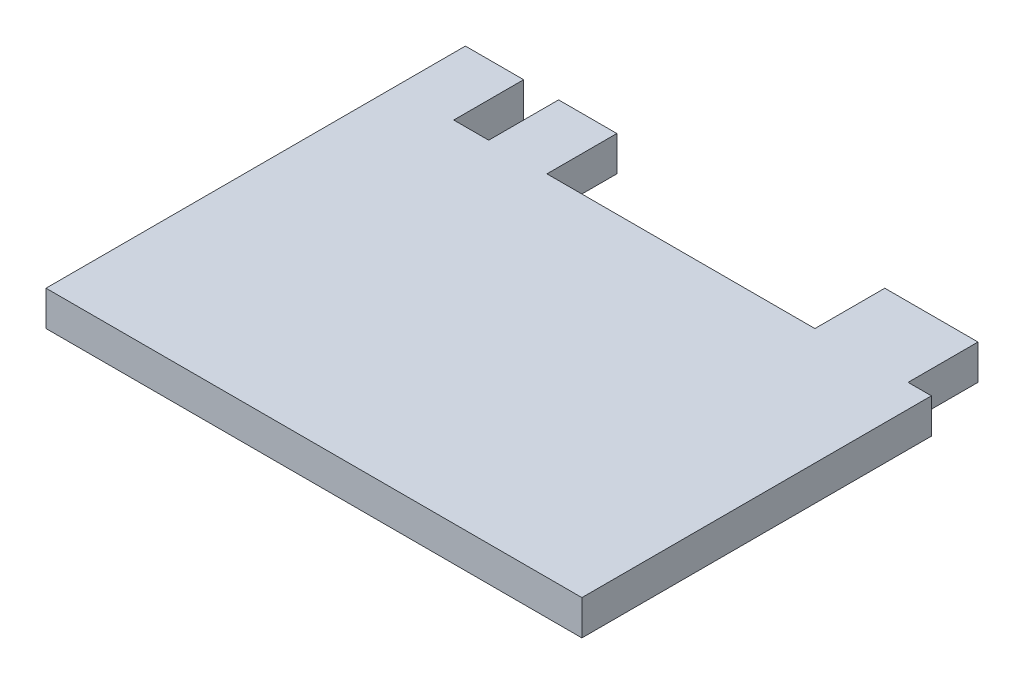
ISO-10303-21;
HEADER;
FILE_DESCRIPTION(('STEP AP214'),'2;1');
FILE_NAME('part.step','',(''),(''),'','','');
FILE_SCHEMA(('AUTOMOTIVE_DESIGN { 1 0 10303 214 1 1 1 1 }'));
ENDSEC;
DATA;
#1=APPLICATION_CONTEXT('core data for automotive mechanical design processes');
#2=APPLICATION_PROTOCOL_DEFINITION('international standard','automotive_design',2000,#1);
#3=PRODUCT_CONTEXT('',#1,'mechanical');
#4=PRODUCT('Part','Part','',(#3));
#5=PRODUCT_RELATED_PRODUCT_CATEGORY('part','',(#4));
#6=PRODUCT_DEFINITION_FORMATION('','',#4);
#7=PRODUCT_DEFINITION_CONTEXT('part definition',#1,'design');
#8=PRODUCT_DEFINITION('design','',#6,#7);
#9=PRODUCT_DEFINITION_SHAPE('','',#8);
#10=(LENGTH_UNIT() NAMED_UNIT(*) SI_UNIT(.MILLI.,.METRE.));
#11=(NAMED_UNIT(*) PLANE_ANGLE_UNIT() SI_UNIT($,.RADIAN.));
#12=(NAMED_UNIT(*) SI_UNIT($,.STERADIAN.) SOLID_ANGLE_UNIT());
#13=UNCERTAINTY_MEASURE_WITH_UNIT(LENGTH_MEASURE(1.E-05),#10,'distance_accuracy_value','');
#14=(GEOMETRIC_REPRESENTATION_CONTEXT(3) GLOBAL_UNCERTAINTY_ASSIGNED_CONTEXT((#13)) GLOBAL_UNIT_ASSIGNED_CONTEXT((#10,
#11,#12)) REPRESENTATION_CONTEXT('',''));
#15=CARTESIAN_POINT('',(0.,0.,0.));
#16=DIRECTION('',(0.,0.,1.));
#17=DIRECTION('',(1.,0.,0.));
#18=AXIS2_PLACEMENT_3D('',#15,#16,#17);
#19=CARTESIAN_POINT('',(11.5,1.5,0.));
#20=DIRECTION('',(-1.,0.,0.));
#21=DIRECTION('',(0.,0.,1.));
#22=AXIS2_PLACEMENT_3D('',#19,#20,#21);
#23=PLANE('',#22);
#24=DIRECTION('',(0.,0.,-1.));
#25=VECTOR('',#24,1.);
#26=CARTESIAN_POINT('',(11.5,0.,0.));
#27=LINE('',#26,#25);
#28=CARTESIAN_POINT('',(11.5,0.,0.));
#29=VERTEX_POINT('',#28);
#30=CARTESIAN_POINT('',(11.5,0.,-15.));
#31=VERTEX_POINT('',#30);
#32=EDGE_CURVE('E167',#29,#31,#27,.T.);
#33=ORIENTED_EDGE('',*,*,#32,.T.);
#34=DIRECTION('',(0.,-1.,0.));
#35=VECTOR('',#34,1.);
#36=CARTESIAN_POINT('',(11.5,1.5,-15.));
#37=LINE('',#36,#35);
#38=CARTESIAN_POINT('',(11.5,1.5,-15.));
#39=VERTEX_POINT('',#38);
#40=EDGE_CURVE('E41',#39,#31,#37,.T.);
#41=ORIENTED_EDGE('',*,*,#40,.F.);
#42=DIRECTION('',(0.,0.,-1.));
#43=VECTOR('',#42,1.);
#44=CARTESIAN_POINT('',(11.5,1.5,0.));
#45=LINE('',#44,#43);
#46=CARTESIAN_POINT('',(11.5,1.5,0.));
#47=VERTEX_POINT('',#46);
#48=EDGE_CURVE('E109',#47,#39,#45,.T.);
#49=ORIENTED_EDGE('',*,*,#48,.F.);
#50=DIRECTION('',(0.,-1.,0.));
#51=VECTOR('',#50,1.);
#52=CARTESIAN_POINT('',(11.5,1.5,0.));
#53=LINE('',#52,#51);
#54=EDGE_CURVE('E11',#47,#29,#53,.T.);
#55=ORIENTED_EDGE('',*,*,#54,.T.);
#56=EDGE_LOOP('',(#33,#41,#49,#55));
#57=FACE_BOUND('',#56,.T.);
#58=ADVANCED_FACE('F33',(#57),#23,.F.);
#59=CARTESIAN_POINT('',(11.5,1.5,-15.));
#60=DIRECTION('',(0.,0.,1.));
#61=DIRECTION('',(1.,0.,0.));
#62=AXIS2_PLACEMENT_3D('',#59,#60,#61);
#63=PLANE('',#62);
#64=DIRECTION('',(-1.,0.,0.));
#65=VECTOR('',#64,1.);
#66=CARTESIAN_POINT('',(11.5,0.,-15.));
#67=LINE('',#66,#65);
#68=CARTESIAN_POINT('',(10.5,0.,-15.));
#69=VERTEX_POINT('',#68);
#70=EDGE_CURVE('E169',#31,#69,#67,.T.);
#71=ORIENTED_EDGE('',*,*,#70,.T.);
#72=DIRECTION('',(0.,-1.,0.));
#73=VECTOR('',#72,1.);
#74=CARTESIAN_POINT('',(10.5,1.5,-15.));
#75=LINE('',#74,#73);
#76=CARTESIAN_POINT('',(10.5,1.5,-15.));
#77=VERTEX_POINT('',#76);
#78=EDGE_CURVE('E218',#77,#69,#75,.T.);
#79=ORIENTED_EDGE('',*,*,#78,.F.);
#80=DIRECTION('',(-1.,0.,0.));
#81=VECTOR('',#80,1.);
#82=CARTESIAN_POINT('',(11.5,1.5,-15.));
#83=LINE('',#82,#81);
#84=EDGE_CURVE('E226',#39,#77,#83,.T.);
#85=ORIENTED_EDGE('',*,*,#84,.F.);
#86=ORIENTED_EDGE('',*,*,#40,.T.);
#87=EDGE_LOOP('',(#71,#79,#85,#86));
#88=FACE_BOUND('',#87,.T.);
#89=ADVANCED_FACE('F224',(#88),#63,.F.);
#90=CARTESIAN_POINT('',(10.5,1.5,-15.));
#91=DIRECTION('',(-1.,0.,0.));
#92=DIRECTION('',(0.,0.,1.));
#93=AXIS2_PLACEMENT_3D('',#90,#91,#92);
#94=PLANE('',#93);
#95=DIRECTION('',(0.,0.,-1.));
#96=VECTOR('',#95,1.);
#97=CARTESIAN_POINT('',(10.5,0.,-15.));
#98=LINE('',#97,#96);
#99=CARTESIAN_POINT('',(10.5,0.,-18.));
#100=VERTEX_POINT('',#99);
#101=EDGE_CURVE('E171',#69,#100,#98,.T.);
#102=ORIENTED_EDGE('',*,*,#101,.T.);
#103=DIRECTION('',(0.,-1.,0.));
#104=VECTOR('',#103,1.);
#105=CARTESIAN_POINT('',(10.5,1.5,-18.));
#106=LINE('',#105,#104);
#107=CARTESIAN_POINT('',(10.5,1.5,-18.));
#108=VERTEX_POINT('',#107);
#109=EDGE_CURVE('E215',#108,#100,#106,.T.);
#110=ORIENTED_EDGE('',*,*,#109,.F.);
#111=DIRECTION('',(0.,0.,-1.));
#112=VECTOR('',#111,1.);
#113=CARTESIAN_POINT('',(10.5,1.5,-15.));
#114=LINE('',#113,#112);
#115=EDGE_CURVE('E243',#77,#108,#114,.T.);
#116=ORIENTED_EDGE('',*,*,#115,.F.);
#117=ORIENTED_EDGE('',*,*,#78,.T.);
#118=EDGE_LOOP('',(#102,#110,#116,#117));
#119=FACE_BOUND('',#118,.T.);
#120=ADVANCED_FACE('F234',(#119),#94,.F.);
#121=CARTESIAN_POINT('',(10.5,1.5,-18.));
#122=DIRECTION('',(0.,0.,1.));
#123=DIRECTION('',(1.,0.,0.));
#124=AXIS2_PLACEMENT_3D('',#121,#122,#123);
#125=PLANE('',#124);
#126=DIRECTION('',(-1.,0.,0.));
#127=VECTOR('',#126,1.);
#128=CARTESIAN_POINT('',(10.5,0.,-18.));
#129=LINE('',#128,#127);
#130=CARTESIAN_POINT('',(6.5,0.,-18.));
#131=VERTEX_POINT('',#130);
#132=EDGE_CURVE('E173',#100,#131,#129,.T.);
#133=ORIENTED_EDGE('',*,*,#132,.T.);
#134=DIRECTION('',(0.,-1.,0.));
#135=VECTOR('',#134,1.);
#136=CARTESIAN_POINT('',(6.5,1.5,-18.));
#137=LINE('',#136,#135);
#138=CARTESIAN_POINT('',(6.5,1.5,-18.));
#139=VERTEX_POINT('',#138);
#140=EDGE_CURVE('E212',#139,#131,#137,.T.);
#141=ORIENTED_EDGE('',*,*,#140,.F.);
#142=DIRECTION('',(-1.,0.,0.));
#143=VECTOR('',#142,1.);
#144=CARTESIAN_POINT('',(10.5,1.5,-18.));
#145=LINE('',#144,#143);
#146=EDGE_CURVE('E240',#108,#139,#145,.T.);
#147=ORIENTED_EDGE('',*,*,#146,.F.);
#148=ORIENTED_EDGE('',*,*,#109,.T.);
#149=EDGE_LOOP('',(#133,#141,#147,#148));
#150=FACE_BOUND('',#149,.T.);
#151=ADVANCED_FACE('F238',(#150),#125,.F.);
#152=CARTESIAN_POINT('',(6.5,1.5,-18.));
#153=DIRECTION('',(1.,0.,0.));
#154=DIRECTION('',(0.,0.,-1.));
#155=AXIS2_PLACEMENT_3D('',#152,#153,#154);
#156=PLANE('',#155);
#157=DIRECTION('',(0.,0.,1.));
#158=VECTOR('',#157,1.);
#159=CARTESIAN_POINT('',(6.5,0.,-18.));
#160=LINE('',#159,#158);
#161=CARTESIAN_POINT('',(6.5,0.,-15.));
#162=VERTEX_POINT('',#161);
#163=EDGE_CURVE('E175',#131,#162,#160,.T.);
#164=ORIENTED_EDGE('',*,*,#163,.T.);
#165=DIRECTION('',(0.,-1.,0.));
#166=VECTOR('',#165,1.);
#167=CARTESIAN_POINT('',(6.5,1.5,-15.));
#168=LINE('',#167,#166);
#169=CARTESIAN_POINT('',(6.5,1.5,-15.));
#170=VERTEX_POINT('',#169);
#171=EDGE_CURVE('E209',#170,#162,#168,.T.);
#172=ORIENTED_EDGE('',*,*,#171,.F.);
#173=DIRECTION('',(0.,0.,1.));
#174=VECTOR('',#173,1.);
#175=CARTESIAN_POINT('',(6.5,1.5,-18.));
#176=LINE('',#175,#174);
#177=EDGE_CURVE('E242',#139,#170,#176,.T.);
#178=ORIENTED_EDGE('',*,*,#177,.F.);
#179=ORIENTED_EDGE('',*,*,#140,.T.);
#180=EDGE_LOOP('',(#164,#172,#178,#179));
#181=FACE_BOUND('',#180,.T.);
#182=ADVANCED_FACE('F283',(#181),#156,.F.);
#183=CARTESIAN_POINT('',(6.5,1.5,-15.));
#184=DIRECTION('',(0.,0.,1.));
#185=DIRECTION('',(1.,0.,0.));
#186=AXIS2_PLACEMENT_3D('',#183,#184,#185);
#187=PLANE('',#186);
#188=DIRECTION('',(-1.,0.,0.));
#189=VECTOR('',#188,1.);
#190=CARTESIAN_POINT('',(6.5,0.,-15.));
#191=LINE('',#190,#189);
#192=CARTESIAN_POINT('',(-5.,0.,-15.));
#193=VERTEX_POINT('',#192);
#194=EDGE_CURVE('E177',#162,#193,#191,.T.);
#195=ORIENTED_EDGE('',*,*,#194,.T.);
#196=DIRECTION('',(0.,-1.,0.));
#197=VECTOR('',#196,1.);
#198=CARTESIAN_POINT('',(-5.,1.5,-15.));
#199=LINE('',#198,#197);
#200=CARTESIAN_POINT('',(-5.,1.5,-15.));
#201=VERTEX_POINT('',#200);
#202=EDGE_CURVE('E206',#201,#193,#199,.T.);
#203=ORIENTED_EDGE('',*,*,#202,.F.);
#204=DIRECTION('',(-1.,0.,0.));
#205=VECTOR('',#204,1.);
#206=CARTESIAN_POINT('',(6.5,1.5,-15.));
#207=LINE('',#206,#205);
#208=EDGE_CURVE('E245',#170,#201,#207,.T.);
#209=ORIENTED_EDGE('',*,*,#208,.F.);
#210=ORIENTED_EDGE('',*,*,#171,.T.);
#211=EDGE_LOOP('',(#195,#203,#209,#210));
#212=FACE_BOUND('',#211,.T.);
#213=ADVANCED_FACE('F286',(#212),#187,.F.);
#214=CARTESIAN_POINT('',(-5.,1.5,-18.));
#215=DIRECTION('',(-1.,0.,0.));
#216=DIRECTION('',(0.,0.,1.));
#217=AXIS2_PLACEMENT_3D('',#214,#215,#216);
#218=PLANE('',#217);
#219=DIRECTION('',(0.,0.,-1.));
#220=VECTOR('',#219,1.);
#221=CARTESIAN_POINT('',(-5.,0.,-18.));
#222=LINE('',#221,#220);
#223=CARTESIAN_POINT('',(-5.,0.,-18.));
#224=VERTEX_POINT('',#223);
#225=EDGE_CURVE('E179',#193,#224,#222,.T.);
#226=ORIENTED_EDGE('',*,*,#225,.T.);
#227=DIRECTION('',(0.,-1.,0.));
#228=VECTOR('',#227,1.);
#229=CARTESIAN_POINT('',(-5.,1.5,-18.));
#230=LINE('',#229,#228);
#231=CARTESIAN_POINT('',(-5.,1.5,-18.));
#232=VERTEX_POINT('',#231);
#233=EDGE_CURVE('E203',#232,#224,#230,.T.);
#234=ORIENTED_EDGE('',*,*,#233,.F.);
#235=DIRECTION('',(0.,0.,-1.));
#236=VECTOR('',#235,1.);
#237=CARTESIAN_POINT('',(-5.,1.5,-18.));
#238=LINE('',#237,#236);
#239=EDGE_CURVE('E251',#201,#232,#238,.T.);
#240=ORIENTED_EDGE('',*,*,#239,.F.);
#241=ORIENTED_EDGE('',*,*,#202,.T.);
#242=EDGE_LOOP('',(#226,#234,#240,#241));
#243=FACE_BOUND('',#242,.T.);
#244=ADVANCED_FACE('F290',(#243),#218,.F.);
#245=CARTESIAN_POINT('',(-7.5,1.5,-18.));
#246=DIRECTION('',(0.,0.,1.));
#247=DIRECTION('',(1.,0.,0.));
#248=AXIS2_PLACEMENT_3D('',#245,#246,#247);
#249=PLANE('',#248);
#250=DIRECTION('',(-1.,0.,0.));
#251=VECTOR('',#250,1.);
#252=CARTESIAN_POINT('',(-7.5,0.,-18.));
#253=LINE('',#252,#251);
#254=CARTESIAN_POINT('',(-7.5,0.,-18.));
#255=VERTEX_POINT('',#254);
#256=EDGE_CURVE('E181',#224,#255,#253,.T.);
#257=ORIENTED_EDGE('',*,*,#256,.T.);
#258=DIRECTION('',(0.,-1.,0.));
#259=VECTOR('',#258,1.);
#260=CARTESIAN_POINT('',(-7.5,1.5,-18.));
#261=LINE('',#260,#259);
#262=CARTESIAN_POINT('',(-7.5,1.5,-18.));
#263=VERTEX_POINT('',#262);
#264=EDGE_CURVE('E200',#263,#255,#261,.T.);
#265=ORIENTED_EDGE('',*,*,#264,.F.);
#266=DIRECTION('',(-1.,0.,0.));
#267=VECTOR('',#266,1.);
#268=CARTESIAN_POINT('',(-7.5,1.5,-18.));
#269=LINE('',#268,#267);
#270=EDGE_CURVE('E253',#232,#263,#269,.T.);
#271=ORIENTED_EDGE('',*,*,#270,.F.);
#272=ORIENTED_EDGE('',*,*,#233,.T.);
#273=EDGE_LOOP('',(#257,#265,#271,#272));
#274=FACE_BOUND('',#273,.T.);
#275=ADVANCED_FACE('F294',(#274),#249,.F.);
#276=CARTESIAN_POINT('',(-7.5,1.5,-18.));
#277=DIRECTION('',(1.,0.,0.));
#278=DIRECTION('',(0.,0.,-1.));
#279=AXIS2_PLACEMENT_3D('',#276,#277,#278);
#280=PLANE('',#279);
#281=DIRECTION('',(0.,0.,1.));
#282=VECTOR('',#281,1.);
#283=CARTESIAN_POINT('',(-7.5,0.,-18.));
#284=LINE('',#283,#282);
#285=CARTESIAN_POINT('',(-7.5,0.,-15.));
#286=VERTEX_POINT('',#285);
#287=EDGE_CURVE('E183',#255,#286,#284,.T.);
#288=ORIENTED_EDGE('',*,*,#287,.T.);
#289=DIRECTION('',(0.,-1.,0.));
#290=VECTOR('',#289,1.);
#291=CARTESIAN_POINT('',(-7.5,1.5,-15.));
#292=LINE('',#291,#290);
#293=CARTESIAN_POINT('',(-7.5,1.5,-15.));
#294=VERTEX_POINT('',#293);
#295=EDGE_CURVE('E197',#294,#286,#292,.T.);
#296=ORIENTED_EDGE('',*,*,#295,.F.);
#297=DIRECTION('',(0.,0.,1.));
#298=VECTOR('',#297,1.);
#299=CARTESIAN_POINT('',(-7.5,1.5,-18.));
#300=LINE('',#299,#298);
#301=EDGE_CURVE('E255',#263,#294,#300,.T.);
#302=ORIENTED_EDGE('',*,*,#301,.F.);
#303=ORIENTED_EDGE('',*,*,#264,.T.);
#304=EDGE_LOOP('',(#288,#296,#302,#303));
#305=FACE_BOUND('',#304,.T.);
#306=ADVANCED_FACE('F261',(#305),#280,.F.);
#307=CARTESIAN_POINT('',(-7.5,1.5,-15.));
#308=DIRECTION('',(0.,0.,1.));
#309=DIRECTION('',(1.,0.,0.));
#310=AXIS2_PLACEMENT_3D('',#307,#308,#309);
#311=PLANE('',#310);
#312=DIRECTION('',(-1.,0.,0.));
#313=VECTOR('',#312,1.);
#314=CARTESIAN_POINT('',(-7.5,0.,-15.));
#315=LINE('',#314,#313);
#316=CARTESIAN_POINT('',(-9.,0.,-15.));
#317=VERTEX_POINT('',#316);
#318=EDGE_CURVE('E185',#286,#317,#315,.T.);
#319=ORIENTED_EDGE('',*,*,#318,.T.);
#320=DIRECTION('',(0.,-1.,0.));
#321=VECTOR('',#320,1.);
#322=CARTESIAN_POINT('',(-9.,1.5,-15.));
#323=LINE('',#322,#321);
#324=CARTESIAN_POINT('',(-9.,1.5,-15.));
#325=VERTEX_POINT('',#324);
#326=EDGE_CURVE('E158',#325,#317,#323,.T.);
#327=ORIENTED_EDGE('',*,*,#326,.F.);
#328=DIRECTION('',(-1.,0.,0.));
#329=VECTOR('',#328,1.);
#330=CARTESIAN_POINT('',(-7.5,1.5,-15.));
#331=LINE('',#330,#329);
#332=EDGE_CURVE('E147',#294,#325,#331,.T.);
#333=ORIENTED_EDGE('',*,*,#332,.F.);
#334=ORIENTED_EDGE('',*,*,#295,.T.);
#335=EDGE_LOOP('',(#319,#327,#333,#334));
#336=FACE_BOUND('',#335,.T.);
#337=ADVANCED_FACE('F265',(#336),#311,.F.);
#338=CARTESIAN_POINT('',(-9.,1.5,-18.));
#339=DIRECTION('',(-1.,0.,0.));
#340=DIRECTION('',(0.,0.,1.));
#341=AXIS2_PLACEMENT_3D('',#338,#339,#340);
#342=PLANE('',#341);
#343=DIRECTION('',(0.,0.,-1.));
#344=VECTOR('',#343,1.);
#345=CARTESIAN_POINT('',(-9.,0.,-18.));
#346=LINE('',#345,#344);
#347=CARTESIAN_POINT('',(-9.,0.,-18.));
#348=VERTEX_POINT('',#347);
#349=EDGE_CURVE('E156',#317,#348,#346,.T.);
#350=ORIENTED_EDGE('',*,*,#349,.T.);
#351=DIRECTION('',(0.,-1.,0.));
#352=VECTOR('',#351,1.);
#353=CARTESIAN_POINT('',(-9.,1.5,-18.));
#354=LINE('',#353,#352);
#355=CARTESIAN_POINT('',(-9.,1.5,-18.));
#356=VERTEX_POINT('',#355);
#357=EDGE_CURVE('E153',#356,#348,#354,.T.);
#358=ORIENTED_EDGE('',*,*,#357,.F.);
#359=DIRECTION('',(0.,0.,-1.));
#360=VECTOR('',#359,1.);
#361=CARTESIAN_POINT('',(-9.,1.5,-18.));
#362=LINE('',#361,#360);
#363=EDGE_CURVE('E140',#325,#356,#362,.T.);
#364=ORIENTED_EDGE('',*,*,#363,.F.);
#365=ORIENTED_EDGE('',*,*,#326,.T.);
#366=EDGE_LOOP('',(#350,#358,#364,#365));
#367=FACE_BOUND('',#366,.T.);
#368=ADVANCED_FACE('F154',(#367),#342,.F.);
#369=CARTESIAN_POINT('',(-11.5,1.5,-18.));
#370=DIRECTION('',(0.,0.,1.));
#371=DIRECTION('',(1.,0.,0.));
#372=AXIS2_PLACEMENT_3D('',#369,#370,#371);
#373=PLANE('',#372);
#374=DIRECTION('',(-1.,0.,0.));
#375=VECTOR('',#374,1.);
#376=CARTESIAN_POINT('',(-11.5,0.,-18.));
#377=LINE('',#376,#375);
#378=CARTESIAN_POINT('',(-11.5,0.,-18.));
#379=VERTEX_POINT('',#378);
#380=EDGE_CURVE('E188',#348,#379,#377,.T.);
#381=ORIENTED_EDGE('',*,*,#380,.T.);
#382=DIRECTION('',(0.,-1.,0.));
#383=VECTOR('',#382,1.);
#384=CARTESIAN_POINT('',(-11.5,1.5,-18.));
#385=LINE('',#384,#383);
#386=CARTESIAN_POINT('',(-11.5,1.5,-18.));
#387=VERTEX_POINT('',#386);
#388=EDGE_CURVE('E159',#387,#379,#385,.T.);
#389=ORIENTED_EDGE('',*,*,#388,.F.);
#390=DIRECTION('',(-1.,0.,0.));
#391=VECTOR('',#390,1.);
#392=CARTESIAN_POINT('',(-11.5,1.5,-18.));
#393=LINE('',#392,#391);
#394=EDGE_CURVE('E144',#356,#387,#393,.T.);
#395=ORIENTED_EDGE('',*,*,#394,.F.);
#396=ORIENTED_EDGE('',*,*,#357,.T.);
#397=EDGE_LOOP('',(#381,#389,#395,#396));
#398=FACE_BOUND('',#397,.T.);
#399=ADVANCED_FACE('F161',(#398),#373,.F.);
#400=CARTESIAN_POINT('',(-11.5,1.5,-15.));
#401=DIRECTION('',(1.,0.,0.));
#402=DIRECTION('',(0.,0.,-1.));
#403=AXIS2_PLACEMENT_3D('',#400,#401,#402);
#404=PLANE('',#403);
#405=DIRECTION('',(0.,0.,1.));
#406=VECTOR('',#405,1.);
#407=CARTESIAN_POINT('',(-11.5,0.,-15.));
#408=LINE('',#407,#406);
#409=CARTESIAN_POINT('',(-11.5,0.,0.));
#410=VERTEX_POINT('',#409);
#411=EDGE_CURVE('E96',#379,#410,#408,.T.);
#412=ORIENTED_EDGE('',*,*,#411,.T.);
#413=DIRECTION('',(0.,-1.,0.));
#414=VECTOR('',#413,1.);
#415=CARTESIAN_POINT('',(-11.5,1.5,0.));
#416=LINE('',#415,#414);
#417=CARTESIAN_POINT('',(-11.5,1.5,0.));
#418=VERTEX_POINT('',#417);
#419=EDGE_CURVE('E163',#418,#410,#416,.T.);
#420=ORIENTED_EDGE('',*,*,#419,.F.);
#421=DIRECTION('',(0.,0.,1.));
#422=VECTOR('',#421,1.);
#423=CARTESIAN_POINT('',(-11.5,1.5,-15.));
#424=LINE('',#423,#422);
#425=EDGE_CURVE('E49',#387,#418,#424,.T.);
#426=ORIENTED_EDGE('',*,*,#425,.F.);
#427=ORIENTED_EDGE('',*,*,#388,.T.);
#428=EDGE_LOOP('',(#412,#420,#426,#427));
#429=FACE_BOUND('',#428,.T.);
#430=ADVANCED_FACE('F266',(#429),#404,.F.);
#431=CARTESIAN_POINT('',(0.,1.5,0.));
#432=DIRECTION('',(0.,0.,-1.));
#433=DIRECTION('',(-1.,0.,0.));
#434=AXIS2_PLACEMENT_3D('',#431,#432,#433);
#435=PLANE('',#434);
#436=DIRECTION('',(1.,0.,0.));
#437=VECTOR('',#436,1.);
#438=CARTESIAN_POINT('',(0.,0.,0.));
#439=LINE('',#438,#437);
#440=EDGE_CURVE('E191',#410,#29,#439,.T.);
#441=ORIENTED_EDGE('',*,*,#440,.T.);
#442=ORIENTED_EDGE('',*,*,#54,.F.);
#443=DIRECTION('',(1.,0.,0.));
#444=VECTOR('',#443,1.);
#445=CARTESIAN_POINT('',(0.,1.5,0.));
#446=LINE('',#445,#444);
#447=EDGE_CURVE('E193',#418,#47,#446,.T.);
#448=ORIENTED_EDGE('',*,*,#447,.F.);
#449=ORIENTED_EDGE('',*,*,#419,.T.);
#450=EDGE_LOOP('',(#441,#442,#448,#449));
#451=FACE_BOUND('',#450,.T.);
#452=ADVANCED_FACE('F268',(#451),#435,.F.);
#453=CARTESIAN_POINT('',(0.,1.5,0.));
#454=DIRECTION('',(0.,1.,0.));
#455=DIRECTION('',(0.,0.,1.));
#456=AXIS2_PLACEMENT_3D('',#453,#454,#455);
#457=PLANE('',#456);
#458=ORIENTED_EDGE('',*,*,#447,.T.);
#459=ORIENTED_EDGE('',*,*,#48,.T.);
#460=ORIENTED_EDGE('',*,*,#84,.T.);
#461=ORIENTED_EDGE('',*,*,#115,.T.);
#462=ORIENTED_EDGE('',*,*,#146,.T.);
#463=ORIENTED_EDGE('',*,*,#177,.T.);
#464=ORIENTED_EDGE('',*,*,#208,.T.);
#465=ORIENTED_EDGE('',*,*,#239,.T.);
#466=ORIENTED_EDGE('',*,*,#270,.T.);
#467=ORIENTED_EDGE('',*,*,#301,.T.);
#468=ORIENTED_EDGE('',*,*,#332,.T.);
#469=ORIENTED_EDGE('',*,*,#363,.T.);
#470=ORIENTED_EDGE('',*,*,#394,.T.);
#471=ORIENTED_EDGE('',*,*,#425,.T.);
#472=EDGE_LOOP('',(#458,#459,#460,#461,#462,#463,#464,#465,#466,#467,#468,#469,#470,#471));
#473=FACE_BOUND('',#472,.T.);
#474=ADVANCED_FACE('F142',(#473),#457,.T.);
#475=CARTESIAN_POINT('',(0.,0.,0.));
#476=DIRECTION('',(0.,1.,0.));
#477=DIRECTION('',(0.,0.,1.));
#478=AXIS2_PLACEMENT_3D('',#475,#476,#477);
#479=PLANE('',#478);
#480=ORIENTED_EDGE('',*,*,#32,.F.);
#481=ORIENTED_EDGE('',*,*,#440,.F.);
#482=ORIENTED_EDGE('',*,*,#411,.F.);
#483=ORIENTED_EDGE('',*,*,#380,.F.);
#484=ORIENTED_EDGE('',*,*,#349,.F.);
#485=ORIENTED_EDGE('',*,*,#318,.F.);
#486=ORIENTED_EDGE('',*,*,#287,.F.);
#487=ORIENTED_EDGE('',*,*,#256,.F.);
#488=ORIENTED_EDGE('',*,*,#225,.F.);
#489=ORIENTED_EDGE('',*,*,#194,.F.);
#490=ORIENTED_EDGE('',*,*,#163,.F.);
#491=ORIENTED_EDGE('',*,*,#132,.F.);
#492=ORIENTED_EDGE('',*,*,#101,.F.);
#493=ORIENTED_EDGE('',*,*,#70,.F.);
#494=EDGE_LOOP('',(#480,#481,#482,#483,#484,#485,#486,#487,#488,#489,#490,#491,#492,#493));
#495=FACE_BOUND('',#494,.T.);
#496=ADVANCED_FACE('F229',(#495),#479,.F.);
#497=CLOSED_SHELL('',(#58,#89,#120,#151,#182,#213,#244,#275,#306,#337,#368,#399,#430,#452,#474,#496));
#498=MANIFOLD_SOLID_BREP('B2',#497);
#499=ADVANCED_BREP_SHAPE_REPRESENTATION('',(#18,#498),#14);
#500=SHAPE_DEFINITION_REPRESENTATION(#9,#499);
ENDSEC;
END-ISO-10303-21;
